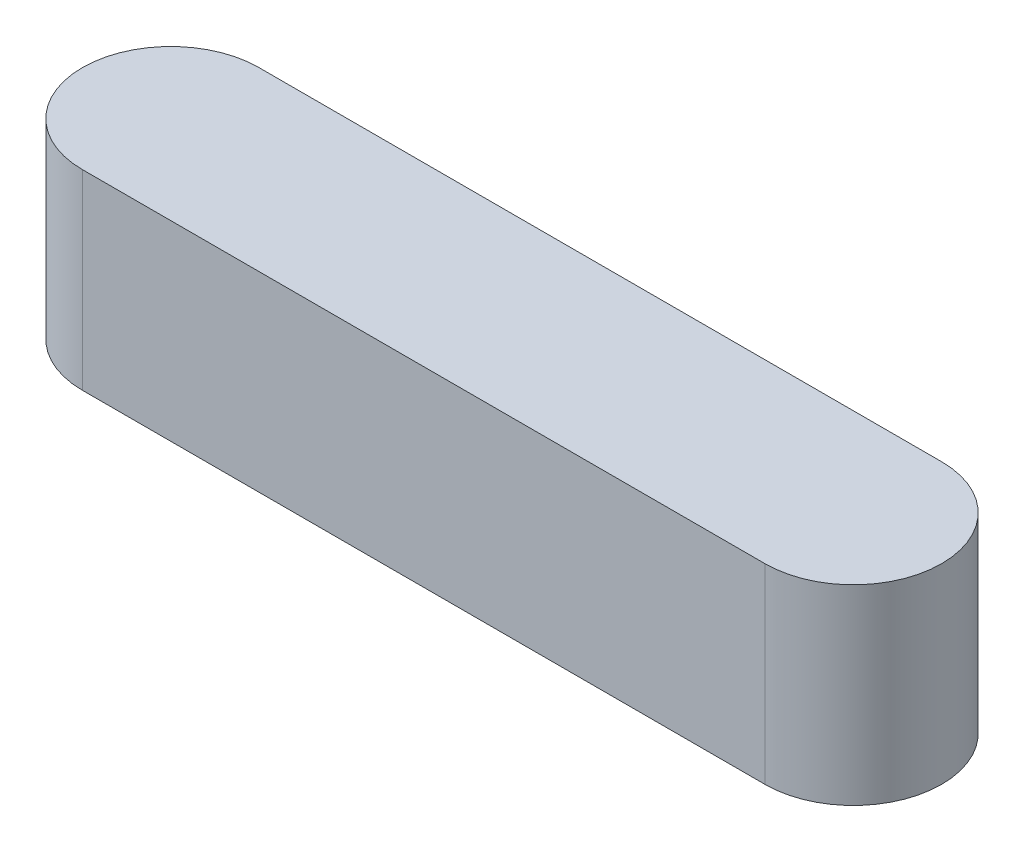
ISO-10303-21;
HEADER;
FILE_DESCRIPTION(('STEP AP214'),'2;1');
FILE_NAME('part.step','',(''),(''),'','','');
FILE_SCHEMA(('AUTOMOTIVE_DESIGN { 1 0 10303 214 1 1 1 1 }'));
ENDSEC;
DATA;
#1=APPLICATION_CONTEXT('core data for automotive mechanical design processes');
#2=APPLICATION_PROTOCOL_DEFINITION('international standard','automotive_design',2000,#1);
#3=PRODUCT_CONTEXT('',#1,'mechanical');
#4=PRODUCT('Part','Part','',(#3));
#5=PRODUCT_RELATED_PRODUCT_CATEGORY('part','',(#4));
#6=PRODUCT_DEFINITION_FORMATION('','',#4);
#7=PRODUCT_DEFINITION_CONTEXT('part definition',#1,'design');
#8=PRODUCT_DEFINITION('design','',#6,#7);
#9=PRODUCT_DEFINITION_SHAPE('','',#8);
#10=(LENGTH_UNIT() NAMED_UNIT(*) SI_UNIT(.MILLI.,.METRE.));
#11=(NAMED_UNIT(*) PLANE_ANGLE_UNIT() SI_UNIT($,.RADIAN.));
#12=(NAMED_UNIT(*) SI_UNIT($,.STERADIAN.) SOLID_ANGLE_UNIT());
#13=UNCERTAINTY_MEASURE_WITH_UNIT(LENGTH_MEASURE(1.E-05),#10,'distance_accuracy_value','');
#14=(GEOMETRIC_REPRESENTATION_CONTEXT(3) GLOBAL_UNCERTAINTY_ASSIGNED_CONTEXT((#13)) GLOBAL_UNIT_ASSIGNED_CONTEXT((#10,
#11,#12)) REPRESENTATION_CONTEXT('',''));
#15=CARTESIAN_POINT('',(0.,0.,0.));
#16=DIRECTION('',(0.,0.,1.));
#17=DIRECTION('',(1.,0.,0.));
#18=AXIS2_PLACEMENT_3D('',#15,#16,#17);
#19=CARTESIAN_POINT('',(-17.2531191886046,-5.,-0.0500000045421671));
#20=DIRECTION('',(0.,1.,0.));
#21=DIRECTION('',(0.,0.,1.));
#22=AXIS2_PLACEMENT_3D('',#19,#20,#21);
#23=CYLINDRICAL_SURFACE('',#22,3.2340943);
#24=DIRECTION('',(0.,1.,0.));
#25=VECTOR('',#24,1.);
#26=CARTESIAN_POINT('',(-17.2531191886046,-5.,3.18409429545783));
#27=LINE('',#26,#25);
#28=CARTESIAN_POINT('',(-17.2531191886046,-5.,3.18409429545783));
#29=VERTEX_POINT('',#28);
#30=CARTESIAN_POINT('',(-17.2531191886046,2.,3.18409429545783));
#31=VERTEX_POINT('',#30);
#32=EDGE_CURVE('E40',#29,#31,#27,.T.);
#33=ORIENTED_EDGE('',*,*,#32,.T.);
#34=CARTESIAN_POINT('',(-17.2531191886046,2.,-0.0500000045421671));
#35=DIRECTION('',(0.,1.,0.));
#36=DIRECTION('',(0.,0.,1.));
#37=AXIS2_PLACEMENT_3D('',#34,#35,#36);
#38=CIRCLE('',#37,3.2340943);
#39=CARTESIAN_POINT('',(-17.2531191886046,2.,-3.28409430454216));
#40=VERTEX_POINT('',#39);
#41=EDGE_CURVE('E77',#40,#31,#38,.T.);
#42=ORIENTED_EDGE('',*,*,#41,.F.);
#43=DIRECTION('',(0.,1.,0.));
#44=VECTOR('',#43,1.);
#45=CARTESIAN_POINT('',(-17.2531191886046,-5.,-3.28409430454216));
#46=LINE('',#45,#44);
#47=CARTESIAN_POINT('',(-17.2531191886046,-5.,-3.28409430454216));
#48=VERTEX_POINT('',#47);
#49=EDGE_CURVE('E11',#48,#40,#46,.T.);
#50=ORIENTED_EDGE('',*,*,#49,.F.);
#51=CARTESIAN_POINT('',(-17.2531191886046,-5.,-0.0500000045421671));
#52=DIRECTION('',(0.,1.,0.));
#53=DIRECTION('',(0.,0.,1.));
#54=AXIS2_PLACEMENT_3D('',#51,#52,#53);
#55=CIRCLE('',#54,3.2340943);
#56=EDGE_CURVE('E78',#48,#29,#55,.T.);
#57=ORIENTED_EDGE('',*,*,#56,.T.);
#58=EDGE_LOOP('',(#33,#42,#50,#57));
#59=FACE_BOUND('',#58,.T.);
#60=ADVANCED_FACE('F37',(#59),#23,.T.);
#61=CARTESIAN_POINT('',(-17.2531191886046,-5.,-3.28409430454216));
#62=DIRECTION('',(0.,0.,-1.));
#63=DIRECTION('',(-1.,0.,0.));
#64=AXIS2_PLACEMENT_3D('',#61,#62,#63);
#65=PLANE('',#64);
#66=ORIENTED_EDGE('',*,*,#49,.T.);
#67=DIRECTION('',(-1.,0.,0.));
#68=VECTOR('',#67,1.);
#69=CARTESIAN_POINT('',(-17.2531191886046,2.,-3.28409430454216));
#70=LINE('',#69,#68);
#71=CARTESIAN_POINT('',(7.74688081139541,2.,-3.28409430454217));
#72=VERTEX_POINT('',#71);
#73=EDGE_CURVE('E94',#72,#40,#70,.T.);
#74=ORIENTED_EDGE('',*,*,#73,.F.);
#75=DIRECTION('',(0.,1.,0.));
#76=VECTOR('',#75,1.);
#77=CARTESIAN_POINT('',(7.74688081139541,-5.,-3.28409430454217));
#78=LINE('',#77,#76);
#79=CARTESIAN_POINT('',(7.74688081139541,-5.,-3.28409430454217));
#80=VERTEX_POINT('',#79);
#81=EDGE_CURVE('E45',#80,#72,#78,.T.);
#82=ORIENTED_EDGE('',*,*,#81,.F.);
#83=DIRECTION('',(-1.,0.,0.));
#84=VECTOR('',#83,1.);
#85=CARTESIAN_POINT('',(-17.2531191886046,-5.,-3.28409430454216));
#86=LINE('',#85,#84);
#87=EDGE_CURVE('E83',#80,#48,#86,.T.);
#88=ORIENTED_EDGE('',*,*,#87,.T.);
#89=EDGE_LOOP('',(#66,#74,#82,#88));
#90=FACE_BOUND('',#89,.T.);
#91=ADVANCED_FACE('F109',(#90),#65,.T.);
#92=CARTESIAN_POINT('',(7.74688081139541,-5.,-0.0500000045421699));
#93=DIRECTION('',(0.,1.,0.));
#94=DIRECTION('',(0.,0.,1.));
#95=AXIS2_PLACEMENT_3D('',#92,#93,#94);
#96=CYLINDRICAL_SURFACE('',#95,3.2340943);
#97=ORIENTED_EDGE('',*,*,#81,.T.);
#98=CARTESIAN_POINT('',(7.74688081139541,2.,-0.0500000045421699));
#99=DIRECTION('',(0.,1.,0.));
#100=DIRECTION('',(0.,0.,1.));
#101=AXIS2_PLACEMENT_3D('',#98,#99,#100);
#102=CIRCLE('',#101,3.2340943);
#103=CARTESIAN_POINT('',(7.74688081139541,2.,3.18409429545783));
#104=VERTEX_POINT('',#103);
#105=EDGE_CURVE('E90',#104,#72,#102,.T.);
#106=ORIENTED_EDGE('',*,*,#105,.F.);
#107=DIRECTION('',(0.,1.,0.));
#108=VECTOR('',#107,1.);
#109=CARTESIAN_POINT('',(7.74688081139541,-5.,3.18409429545783));
#110=LINE('',#109,#108);
#111=CARTESIAN_POINT('',(7.74688081139541,-5.,3.18409429545783));
#112=VERTEX_POINT('',#111);
#113=EDGE_CURVE('E82',#112,#104,#110,.T.);
#114=ORIENTED_EDGE('',*,*,#113,.F.);
#115=CARTESIAN_POINT('',(7.74688081139541,-5.,-0.0500000045421699));
#116=DIRECTION('',(0.,1.,0.));
#117=DIRECTION('',(0.,0.,1.));
#118=AXIS2_PLACEMENT_3D('',#115,#116,#117);
#119=CIRCLE('',#118,3.2340943);
#120=EDGE_CURVE('E102',#112,#80,#119,.T.);
#121=ORIENTED_EDGE('',*,*,#120,.T.);
#122=EDGE_LOOP('',(#97,#106,#114,#121));
#123=FACE_BOUND('',#122,.T.);
#124=ADVANCED_FACE('F106',(#123),#96,.T.);
#125=CARTESIAN_POINT('',(-17.2531191886046,-5.,3.18409429545783));
#126=DIRECTION('',(0.,0.,1.));
#127=DIRECTION('',(1.,0.,0.));
#128=AXIS2_PLACEMENT_3D('',#125,#126,#127);
#129=PLANE('',#128);
#130=ORIENTED_EDGE('',*,*,#113,.T.);
#131=DIRECTION('',(1.,0.,0.));
#132=VECTOR('',#131,1.);
#133=CARTESIAN_POINT('',(-17.2531191886046,2.,3.18409429545783));
#134=LINE('',#133,#132);
#135=EDGE_CURVE('E85',#31,#104,#134,.T.);
#136=ORIENTED_EDGE('',*,*,#135,.F.);
#137=ORIENTED_EDGE('',*,*,#32,.F.);
#138=DIRECTION('',(1.,0.,0.));
#139=VECTOR('',#138,1.);
#140=CARTESIAN_POINT('',(-17.2531191886046,-5.,3.18409429545783));
#141=LINE('',#140,#139);
#142=EDGE_CURVE('E100',#29,#112,#141,.T.);
#143=ORIENTED_EDGE('',*,*,#142,.T.);
#144=EDGE_LOOP('',(#130,#136,#137,#143));
#145=FACE_BOUND('',#144,.T.);
#146=ADVANCED_FACE('F86',(#145),#129,.T.);
#147=CARTESIAN_POINT('',(-17.2531191886046,-5.,-0.0500000045421671));
#148=DIRECTION('',(0.,1.,0.));
#149=DIRECTION('',(0.,0.,1.));
#150=AXIS2_PLACEMENT_3D('',#147,#148,#149);
#151=PLANE('',#150);
#152=ORIENTED_EDGE('',*,*,#56,.F.);
#153=ORIENTED_EDGE('',*,*,#87,.F.);
#154=ORIENTED_EDGE('',*,*,#120,.F.);
#155=ORIENTED_EDGE('',*,*,#142,.F.);
#156=EDGE_LOOP('',(#152,#153,#154,#155));
#157=FACE_BOUND('',#156,.T.);
#158=ADVANCED_FACE('F111',(#157),#151,.F.);
#159=CARTESIAN_POINT('',(-17.2531191886046,2.,-0.0500000045421671));
#160=DIRECTION('',(0.,1.,0.));
#161=DIRECTION('',(0.,0.,1.));
#162=AXIS2_PLACEMENT_3D('',#159,#160,#161);
#163=PLANE('',#162);
#164=ORIENTED_EDGE('',*,*,#41,.T.);
#165=ORIENTED_EDGE('',*,*,#135,.T.);
#166=ORIENTED_EDGE('',*,*,#105,.T.);
#167=ORIENTED_EDGE('',*,*,#73,.T.);
#168=EDGE_LOOP('',(#164,#165,#166,#167));
#169=FACE_BOUND('',#168,.T.);
#170=ADVANCED_FACE('F93',(#169),#163,.T.);
#171=CLOSED_SHELL('',(#60,#91,#124,#146,#158,#170));
#172=MANIFOLD_SOLID_BREP('B2',#171);
#173=ADVANCED_BREP_SHAPE_REPRESENTATION('',(#18,#172),#14);
#174=SHAPE_DEFINITION_REPRESENTATION(#9,#173);
ENDSEC;
END-ISO-10303-21;
